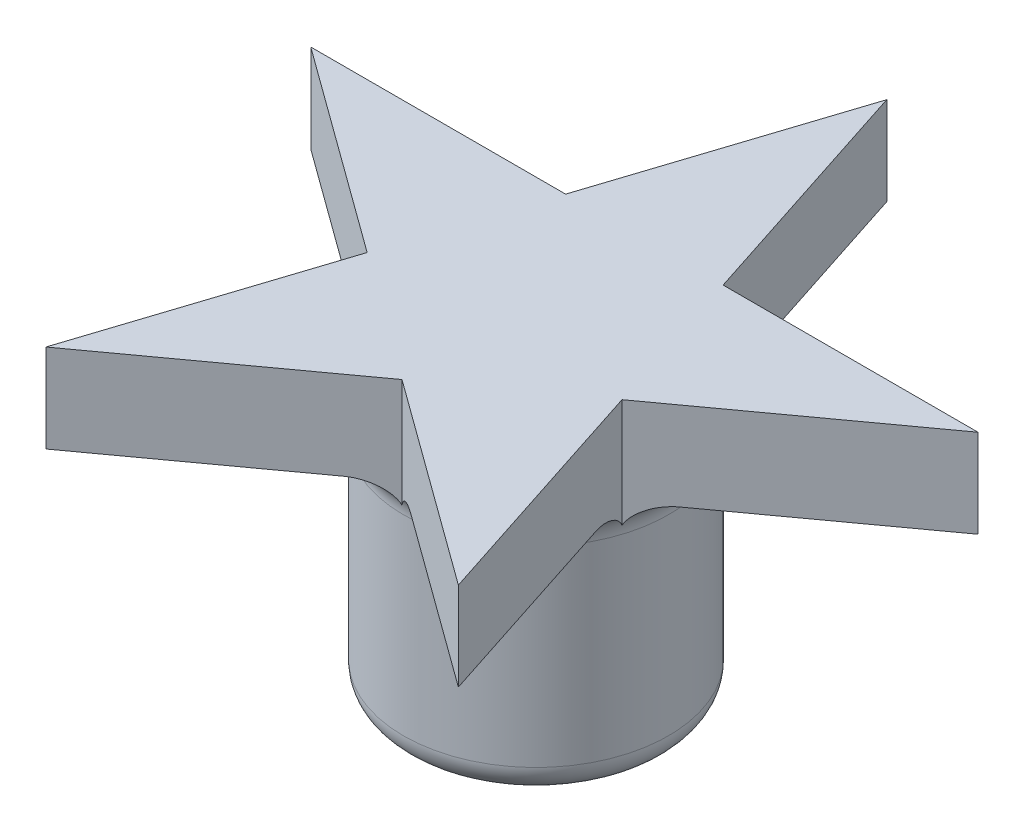
ISO-10303-21;
HEADER;
FILE_DESCRIPTION(('STEP AP214'),'2;1');
FILE_NAME('part.step','',(''),(''),'','','');
FILE_SCHEMA(('AUTOMOTIVE_DESIGN { 1 0 10303 214 1 1 1 1 }'));
ENDSEC;
DATA;
#1=APPLICATION_CONTEXT('core data for automotive mechanical design processes');
#2=APPLICATION_PROTOCOL_DEFINITION('international standard','automotive_design',2000,#1);
#3=PRODUCT_CONTEXT('',#1,'mechanical');
#4=PRODUCT('Part','Part','',(#3));
#5=PRODUCT_RELATED_PRODUCT_CATEGORY('part','',(#4));
#6=PRODUCT_DEFINITION_FORMATION('','',#4);
#7=PRODUCT_DEFINITION_CONTEXT('part definition',#1,'design');
#8=PRODUCT_DEFINITION('design','',#6,#7);
#9=PRODUCT_DEFINITION_SHAPE('','',#8);
#10=(LENGTH_UNIT() NAMED_UNIT(*) SI_UNIT(.MILLI.,.METRE.));
#11=(NAMED_UNIT(*) PLANE_ANGLE_UNIT() SI_UNIT($,.RADIAN.));
#12=(NAMED_UNIT(*) SI_UNIT($,.STERADIAN.) SOLID_ANGLE_UNIT());
#13=UNCERTAINTY_MEASURE_WITH_UNIT(LENGTH_MEASURE(1.E-05),#10,'distance_accuracy_value','');
#14=(GEOMETRIC_REPRESENTATION_CONTEXT(3) GLOBAL_UNCERTAINTY_ASSIGNED_CONTEXT((#13)) GLOBAL_UNIT_ASSIGNED_CONTEXT((#10,
#11,#12)) REPRESENTATION_CONTEXT('',''));
#15=CARTESIAN_POINT('',(0.,0.,0.));
#16=DIRECTION('',(0.,0.,1.));
#17=DIRECTION('',(1.,0.,0.));
#18=AXIS2_PLACEMENT_3D('',#15,#16,#17);
#19=CARTESIAN_POINT('',(0.,8.5,0.));
#20=DIRECTION('',(0.,-1.,0.));
#21=DIRECTION('',(0.,0.,-1.));
#22=AXIS2_PLACEMENT_3D('',#19,#20,#21);
#23=PLANE('',#22);
#24=DIRECTION('',(0.809016994374949,0.,0.58778525229247));
#25=VECTOR('',#24,1.);
#26=CARTESIAN_POINT('',(0.,8.5,4.54887574726061));
#27=LINE('',#26,#25);
#28=CARTESIAN_POINT('',(1.14364664453762,8.5,5.37978367152786));
#29=VERTEX_POINT('',#28);
#30=CARTESIAN_POINT('',(7.00000000000008,8.5,9.6346734432982));
#31=VERTEX_POINT('',#30);
#32=EDGE_CURVE('E224',#29,#31,#27,.T.);
#33=ORIENTED_EDGE('',*,*,#32,.F.);
#34=CARTESIAN_POINT('',(0.,8.5,0.));
#35=DIRECTION('',(0.,-1.,0.));
#36=DIRECTION('',(0.,0.,-1.));
#37=AXIS2_PLACEMENT_3D('',#34,#35,#36);
#38=CIRCLE('',#37,5.5);
#39=CARTESIAN_POINT('',(4.76307206834288,8.5,2.75011717418946));
#40=VERTEX_POINT('',#39);
#41=EDGE_CURVE('E307',#29,#40,#38,.F.);
#42=ORIENTED_EDGE('',*,*,#41,.T.);
#43=DIRECTION('',(0.309016994374952,0.,0.951056516295152));
#44=VECTOR('',#43,1.);
#45=CARTESIAN_POINT('',(4.32623792124928,8.5,1.4056799112035));
#46=LINE('',#45,#44);
#47=EDGE_CURVE('E226',#40,#31,#46,.T.);
#48=ORIENTED_EDGE('',*,*,#47,.T.);
#49=EDGE_LOOP('',(#33,#42,#48));
#50=FACE_BOUND('',#49,.T.);
#51=ADVANCED_FACE('F37',(#50),#23,.T.);
#52=DIRECTION('',(-0.809016994374951,0.,0.587785252292468));
#53=VECTOR('',#52,1.);
#54=CARTESIAN_POINT('',(11.3262379212493,8.5,-3.68011778483395));
#55=LINE('',#54,#53);
#56=CARTESIAN_POINT('',(11.3262379212493,8.5,-3.68011778483395));
#57=VERTEX_POINT('',#56);
#58=CARTESIAN_POINT('',(5.46988456578686,8.5,0.574771986936334));
#59=VERTEX_POINT('',#58);
#60=EDGE_CURVE('E229',#57,#59,#55,.T.);
#61=ORIENTED_EDGE('',*,*,#60,.T.);
#62=CARTESIAN_POINT('',(0.,8.5,0.));
#63=DIRECTION('',(0.,-1.,0.));
#64=DIRECTION('',(0.,0.,-1.));
#65=AXIS2_PLACEMENT_3D('',#62,#63,#64);
#66=CIRCLE('',#65,5.5);
#67=CARTESIAN_POINT('',(4.08738707363873,8.5,-3.68011778483394));
#68=VERTEX_POINT('',#67);
#69=EDGE_CURVE('E305',#59,#68,#66,.F.);
#70=ORIENTED_EDGE('',*,*,#69,.T.);
#71=DIRECTION('',(1.,0.,0.));
#72=VECTOR('',#71,1.);
#73=CARTESIAN_POINT('',(2.67376207875076,8.5,-3.68011778483394));
#74=LINE('',#73,#72);
#75=EDGE_CURVE('E232',#68,#57,#74,.T.);
#76=ORIENTED_EDGE('',*,*,#75,.T.);
#77=EDGE_LOOP('',(#61,#70,#76));
#78=FACE_BOUND('',#77,.T.);
#79=ADVANCED_FACE('F411',(#78),#23,.T.);
#80=DIRECTION('',(0.309016994374951,0.,0.951056516295152));
#81=VECTOR('',#80,1.);
#82=CARTESIAN_POINT('',(0.,8.5,-11.9091113169286));
#83=LINE('',#82,#81);
#84=CARTESIAN_POINT('',(0.,8.5,-11.9091113169286));
#85=VERTEX_POINT('',#84);
#86=CARTESIAN_POINT('',(2.23692793165717,8.5,-5.02455504781985));
#87=VERTEX_POINT('',#86);
#88=EDGE_CURVE('E234',#85,#87,#83,.T.);
#89=ORIENTED_EDGE('',*,*,#88,.T.);
#90=CARTESIAN_POINT('',(0.,8.5,0.));
#91=DIRECTION('',(0.,-1.,0.));
#92=DIRECTION('',(0.,0.,-1.));
#93=AXIS2_PLACEMENT_3D('',#90,#91,#92);
#94=CIRCLE('',#93,5.5);
#95=CARTESIAN_POINT('',(-2.23692793165722,8.5,-5.02455504781983));
#96=VERTEX_POINT('',#95);
#97=EDGE_CURVE('E303',#87,#96,#94,.F.);
#98=ORIENTED_EDGE('',*,*,#97,.T.);
#99=DIRECTION('',(-0.309016994374953,0.,0.951056516295152));
#100=VECTOR('',#99,1.);
#101=CARTESIAN_POINT('',(0.,8.5,-11.9091113169286));
#102=LINE('',#101,#100);
#103=EDGE_CURVE('E237',#85,#96,#102,.T.);
#104=ORIENTED_EDGE('',*,*,#103,.F.);
#105=EDGE_LOOP('',(#89,#98,#104));
#106=FACE_BOUND('',#105,.T.);
#107=ADVANCED_FACE('F417',(#106),#23,.T.);
#108=DIRECTION('',(1.,0.,0.));
#109=VECTOR('',#108,1.);
#110=CARTESIAN_POINT('',(-11.3262379212493,8.5,-3.68011778483392));
#111=LINE('',#110,#109);
#112=CARTESIAN_POINT('',(-11.3262379212493,8.5,-3.68011778483392));
#113=VERTEX_POINT('',#112);
#114=CARTESIAN_POINT('',(-4.08738707363874,8.5,-3.68011778483392));
#115=VERTEX_POINT('',#114);
#116=EDGE_CURVE('E181',#113,#115,#111,.T.);
#117=ORIENTED_EDGE('',*,*,#116,.T.);
#118=CARTESIAN_POINT('',(0.,8.5,0.));
#119=DIRECTION('',(0.,-1.,0.));
#120=DIRECTION('',(0.,0.,-1.));
#121=AXIS2_PLACEMENT_3D('',#118,#119,#120);
#122=CIRCLE('',#121,5.5);
#123=CARTESIAN_POINT('',(-5.46988456578685,8.5,0.574771986936398));
#124=VERTEX_POINT('',#123);
#125=EDGE_CURVE('E301',#115,#124,#122,.F.);
#126=ORIENTED_EDGE('',*,*,#125,.T.);
#127=DIRECTION('',(0.809016994374949,0.,0.587785252292471));
#128=VECTOR('',#127,1.);
#129=CARTESIAN_POINT('',(-11.3262379212493,8.5,-3.68011778483392));
#130=LINE('',#129,#128);
#131=EDGE_CURVE('E217',#113,#124,#130,.T.);
#132=ORIENTED_EDGE('',*,*,#131,.F.);
#133=EDGE_LOOP('',(#117,#126,#132));
#134=FACE_BOUND('',#133,.T.);
#135=ADVANCED_FACE('F422',(#134),#23,.T.);
#136=CARTESIAN_POINT('',(0.,2.5,0.));
#137=DIRECTION('',(0.,-1.,0.));
#138=DIRECTION('',(0.,0.,-1.));
#139=AXIS2_PLACEMENT_3D('',#136,#137,#138);
#140=PLANE('',#139);
#141=CARTESIAN_POINT('',(0.,2.5,0.));
#142=DIRECTION('',(0.,-1.,0.));
#143=DIRECTION('',(0.,0.,-1.));
#144=AXIS2_PLACEMENT_3D('',#141,#142,#143);
#145=CIRCLE('',#144,1.25);
#146=CARTESIAN_POINT('',(0.75,2.5,-1.));
#147=VERTEX_POINT('',#146);
#148=CARTESIAN_POINT('',(0.75,2.5,1.));
#149=VERTEX_POINT('',#148);
#150=EDGE_CURVE('E284',#147,#149,#145,.T.);
#151=ORIENTED_EDGE('',*,*,#150,.T.);
#152=DIRECTION('',(0.,0.,-1.));
#153=VECTOR('',#152,1.);
#154=CARTESIAN_POINT('',(0.75,2.5,1.));
#155=LINE('',#154,#153);
#156=EDGE_CURVE('E263',#149,#147,#155,.T.);
#157=ORIENTED_EDGE('',*,*,#156,.T.);
#158=EDGE_LOOP('',(#151,#157));
#159=FACE_BOUND('',#158,.T.);
#160=ADVANCED_FACE('F387',(#159),#140,.T.);
#161=CARTESIAN_POINT('',(0.,10.,0.));
#162=DIRECTION('',(0.,-1.,0.));
#163=DIRECTION('',(0.,0.,-1.));
#164=AXIS2_PLACEMENT_3D('',#161,#162,#163);
#165=CYLINDRICAL_SURFACE('',#164,4.5);
#166=CARTESIAN_POINT('',(0.,0.999999999999999,0.));
#167=DIRECTION('',(0.,1.,0.));
#168=DIRECTION('',(0.,0.,1.));
#169=AXIS2_PLACEMENT_3D('',#166,#167,#168);
#170=CIRCLE('',#169,4.5);
#171=CARTESIAN_POINT('',(0.,0.999999999999999,4.5));
#172=VERTEX_POINT('',#171);
#173=EDGE_CURVE('E293',#172,#172,#170,.T.);
#174=ORIENTED_EDGE('',*,*,#173,.T.);
#175=EDGE_LOOP('',(#174));
#176=FACE_BOUND('',#175,.T.);
#177=CARTESIAN_POINT('',(0.,7.5,0.));
#178=DIRECTION('',(0.,-1.,0.));
#179=DIRECTION('',(0.,0.,-1.));
#180=AXIS2_PLACEMENT_3D('',#177,#178,#179);
#181=CIRCLE('',#180,4.5);
#182=CARTESIAN_POINT('',(0.,7.5,-4.5));
#183=VERTEX_POINT('',#182);
#184=EDGE_CURVE('E287',#183,#183,#181,.T.);
#185=ORIENTED_EDGE('',*,*,#184,.T.);
#186=EDGE_LOOP('',(#185));
#187=FACE_BOUND('',#186,.T.);
#188=ADVANCED_FACE('F394',(#176,#187),#165,.T.);
#189=CARTESIAN_POINT('',(0.,0.,0.));
#190=DIRECTION('',(0.,1.,0.));
#191=DIRECTION('',(0.,0.,1.));
#192=AXIS2_PLACEMENT_3D('',#189,#190,#191);
#193=PLANE('',#192);
#194=CARTESIAN_POINT('',(0.,0.,0.));
#195=DIRECTION('',(0.,1.,0.));
#196=DIRECTION('',(0.,0.,1.));
#197=AXIS2_PLACEMENT_3D('',#194,#195,#196);
#198=CIRCLE('',#197,3.5);
#199=CARTESIAN_POINT('',(0.,0.,3.5));
#200=VERTEX_POINT('',#199);
#201=EDGE_CURVE('E296',#200,#200,#198,.F.);
#202=ORIENTED_EDGE('',*,*,#201,.T.);
#203=EDGE_LOOP('',(#202));
#204=FACE_BOUND('',#203,.T.);
#205=CARTESIAN_POINT('',(0.,0.,0.));
#206=DIRECTION('',(0.,-1.,0.));
#207=DIRECTION('',(0.,0.,-1.));
#208=AXIS2_PLACEMENT_3D('',#205,#206,#207);
#209=CIRCLE('',#208,1.25);
#210=CARTESIAN_POINT('',(0.,0.,-1.25));
#211=VERTEX_POINT('',#210);
#212=EDGE_CURVE('E278',#211,#211,#209,.T.);
#213=ORIENTED_EDGE('',*,*,#212,.F.);
#214=EDGE_LOOP('',(#213));
#215=FACE_BOUND('',#214,.T.);
#216=ADVANCED_FACE('F390',(#204,#215),#193,.F.);
#217=CARTESIAN_POINT('',(0.,2.5,0.));
#218=DIRECTION('',(0.,-1.,0.));
#219=DIRECTION('',(0.,0.,-1.));
#220=AXIS2_PLACEMENT_3D('',#217,#218,#219);
#221=CYLINDRICAL_SURFACE('',#220,1.25);
#222=ORIENTED_EDGE('',*,*,#150,.F.);
#223=DIRECTION('',(0.,-1.,0.));
#224=VECTOR('',#223,1.);
#225=CARTESIAN_POINT('',(0.75,8.5,-1.));
#226=LINE('',#225,#224);
#227=CARTESIAN_POINT('',(0.75,8.5,-1.));
#228=VERTEX_POINT('',#227);
#229=EDGE_CURVE('E279',#228,#147,#226,.T.);
#230=ORIENTED_EDGE('',*,*,#229,.F.);
#231=CARTESIAN_POINT('',(0.,8.5,0.));
#232=DIRECTION('',(0.,-1.,0.));
#233=DIRECTION('',(0.,0.,-1.));
#234=AXIS2_PLACEMENT_3D('',#231,#232,#233);
#235=CIRCLE('',#234,1.25);
#236=CARTESIAN_POINT('',(-0.75,8.5,-1.));
#237=VERTEX_POINT('',#236);
#238=EDGE_CURVE('E266',#237,#228,#235,.T.);
#239=ORIENTED_EDGE('',*,*,#238,.F.);
#240=DIRECTION('',(0.,-1.,0.));
#241=VECTOR('',#240,1.);
#242=CARTESIAN_POINT('',(-0.75,8.5,-1.));
#243=LINE('',#242,#241);
#244=CARTESIAN_POINT('',(-0.75,2.5,-1.));
#245=VERTEX_POINT('',#244);
#246=EDGE_CURVE('E281',#237,#245,#243,.T.);
#247=ORIENTED_EDGE('',*,*,#246,.T.);
#248=CARTESIAN_POINT('',(-0.75,2.5,1.));
#249=VERTEX_POINT('',#248);
#250=EDGE_CURVE('E288',#249,#245,#145,.T.);
#251=ORIENTED_EDGE('',*,*,#250,.F.);
#252=DIRECTION('',(0.,-1.,0.));
#253=VECTOR('',#252,1.);
#254=CARTESIAN_POINT('',(-0.75,8.5,1.));
#255=LINE('',#254,#253);
#256=CARTESIAN_POINT('',(-0.75,8.5,1.));
#257=VERTEX_POINT('',#256);
#258=EDGE_CURVE('E271',#257,#249,#255,.T.);
#259=ORIENTED_EDGE('',*,*,#258,.F.);
#260=CARTESIAN_POINT('',(0.,8.5,0.));
#261=DIRECTION('',(0.,-1.,0.));
#262=DIRECTION('',(0.,0.,-1.));
#263=AXIS2_PLACEMENT_3D('',#260,#261,#262);
#264=CIRCLE('',#263,1.25);
#265=CARTESIAN_POINT('',(0.75,8.5,1.));
#266=VERTEX_POINT('',#265);
#267=EDGE_CURVE('E259',#266,#257,#264,.T.);
#268=ORIENTED_EDGE('',*,*,#267,.F.);
#269=DIRECTION('',(0.,-1.,0.));
#270=VECTOR('',#269,1.);
#271=CARTESIAN_POINT('',(0.75,8.5,1.));
#272=LINE('',#271,#270);
#273=EDGE_CURVE('E276',#266,#149,#272,.T.);
#274=ORIENTED_EDGE('',*,*,#273,.T.);
#275=EDGE_LOOP('',(#222,#230,#239,#247,#251,#259,#268,#274));
#276=FACE_BOUND('',#275,.T.);
#277=ORIENTED_EDGE('',*,*,#212,.T.);
#278=EDGE_LOOP('',(#277));
#279=FACE_BOUND('',#278,.T.);
#280=ADVANCED_FACE('F385',(#276,#279),#221,.F.);
#281=DIRECTION('',(0.,0.,-1.));
#282=VECTOR('',#281,1.);
#283=CARTESIAN_POINT('',(-0.75,2.5,1.));
#284=LINE('',#283,#282);
#285=EDGE_CURVE('E244',#249,#245,#284,.T.);
#286=ORIENTED_EDGE('',*,*,#285,.F.);
#287=ORIENTED_EDGE('',*,*,#250,.T.);
#288=EDGE_LOOP('',(#286,#287));
#289=FACE_BOUND('',#288,.T.);
#290=ADVANCED_FACE('F378',(#289),#140,.T.);
#291=CARTESIAN_POINT('',(0.75,8.5,1.));
#292=DIRECTION('',(-1.,0.,0.));
#293=DIRECTION('',(0.,0.,1.));
#294=AXIS2_PLACEMENT_3D('',#291,#292,#293);
#295=PLANE('',#294);
#296=ORIENTED_EDGE('',*,*,#156,.F.);
#297=ORIENTED_EDGE('',*,*,#273,.F.);
#298=DIRECTION('',(0.,0.,-1.));
#299=VECTOR('',#298,1.);
#300=CARTESIAN_POINT('',(0.75,8.5,1.));
#301=LINE('',#300,#299);
#302=EDGE_CURVE('E269',#266,#228,#301,.T.);
#303=ORIENTED_EDGE('',*,*,#302,.T.);
#304=ORIENTED_EDGE('',*,*,#229,.T.);
#305=EDGE_LOOP('',(#296,#297,#303,#304));
#306=FACE_BOUND('',#305,.T.);
#307=ADVANCED_FACE('F375',(#306),#295,.T.);
#308=CARTESIAN_POINT('',(-0.75,8.5,1.));
#309=DIRECTION('',(-1.,0.,0.));
#310=DIRECTION('',(0.,0.,1.));
#311=AXIS2_PLACEMENT_3D('',#308,#309,#310);
#312=PLANE('',#311);
#313=ORIENTED_EDGE('',*,*,#285,.T.);
#314=ORIENTED_EDGE('',*,*,#246,.F.);
#315=DIRECTION('',(0.,0.,-1.));
#316=VECTOR('',#315,1.);
#317=CARTESIAN_POINT('',(-0.75,8.5,1.));
#318=LINE('',#317,#316);
#319=EDGE_CURVE('E262',#257,#237,#318,.T.);
#320=ORIENTED_EDGE('',*,*,#319,.F.);
#321=ORIENTED_EDGE('',*,*,#258,.T.);
#322=EDGE_LOOP('',(#313,#314,#320,#321));
#323=FACE_BOUND('',#322,.T.);
#324=ADVANCED_FACE('F373',(#323),#312,.F.);
#325=CARTESIAN_POINT('',(0.,8.5,0.));
#326=DIRECTION('',(0.,-1.,0.));
#327=DIRECTION('',(0.,0.,-1.));
#328=AXIS2_PLACEMENT_3D('',#325,#326,#327);
#329=PLANE('',#328);
#330=ORIENTED_EDGE('',*,*,#267,.T.);
#331=ORIENTED_EDGE('',*,*,#319,.T.);
#332=ORIENTED_EDGE('',*,*,#238,.T.);
#333=ORIENTED_EDGE('',*,*,#302,.F.);
#334=EDGE_LOOP('',(#330,#331,#332,#333));
#335=FACE_BOUND('',#334,.T.);
#336=ADVANCED_FACE('F370',(#335),#329,.T.);
#337=CARTESIAN_POINT('',(-11.3262379212493,8.5,-3.68011778483392));
#338=DIRECTION('',(-0.587785252292471,0.,0.809016994374949));
#339=DIRECTION('',(0.809016994374949,0.,0.587785252292471));
#340=AXIS2_PLACEMENT_3D('',#337,#338,#339);
#341=PLANE('',#340);
#342=DIRECTION('',(0.,1.,0.));
#343=VECTOR('',#342,1.);
#344=CARTESIAN_POINT('',(-4.32623792124934,8.5,1.40567991120352));
#345=LINE('',#344,#343);
#346=CARTESIAN_POINT('',(-4.32623792124934,7.80880844523961,1.40567991120352));
#347=VERTEX_POINT('',#346);
#348=CARTESIAN_POINT('',(-4.32623792124934,11.5,1.40567991120352));
#349=VERTEX_POINT('',#348);
#350=EDGE_CURVE('E65',#347,#349,#345,.T.);
#351=ORIENTED_EDGE('',*,*,#350,.T.);
#352=DIRECTION('',(0.809016994374949,0.,0.587785252292471));
#353=VECTOR('',#352,1.);
#354=CARTESIAN_POINT('',(-11.3262379212493,11.5,-3.68011778483392));
#355=LINE('',#354,#353);
#356=CARTESIAN_POINT('',(-11.3262379212493,11.5,-3.68011778483392));
#357=VERTEX_POINT('',#356);
#358=EDGE_CURVE('E174',#357,#349,#355,.T.);
#359=ORIENTED_EDGE('',*,*,#358,.F.);
#360=DIRECTION('',(0.,1.,0.));
#361=VECTOR('',#360,1.);
#362=CARTESIAN_POINT('',(-11.3262379212493,8.5,-3.68011778483392));
#363=LINE('',#362,#361);
#364=EDGE_CURVE('E242',#113,#357,#363,.T.);
#365=ORIENTED_EDGE('',*,*,#364,.F.);
#366=ORIENTED_EDGE('',*,*,#131,.T.);
#367=CARTESIAN_POINT('',(-5.46988456578685,8.5,0.574771986936398));
#368=CARTESIAN_POINT('',(-5.42674472431918,8.49999157223654,0.606114916414068));
#369=CARTESIAN_POINT('',(-5.38361841330433,8.4976444396555,0.63744801544234));
#370=CARTESIAN_POINT('',(-5.29768635730506,8.48846555977177,0.699881308644754));
#371=CARTESIAN_POINT('',(-5.25488054841814,8.48163473189638,0.730981549246766));
#372=CARTESIAN_POINT('',(-5.16884542659802,8.46346576385764,0.793489724151206));
#373=CARTESIAN_POINT('',(-5.12563058535154,8.4520234349466,0.824887144157777));
#374=CARTESIAN_POINT('',(-5.04010927292878,8.42476796821553,0.887022014683745));
#375=CARTESIAN_POINT('',(-4.99780286768368,8.40895451430191,0.917759417301336));
#376=CARTESIAN_POINT('',(-4.91423925575865,8.37294302757433,0.978471935158607));
#377=CARTESIAN_POINT('',(-4.87298684525021,8.35272794780613,1.00844356577572));
#378=CARTESIAN_POINT('',(-4.79207213895995,8.30791685470545,1.06723154103666));
#379=CARTESIAN_POINT('',(-4.75240954781196,8.28332165980188,1.09604810027656));
#380=CARTESIAN_POINT('',(-4.67561471690901,8.22992573241031,1.15184281085854));
#381=CARTESIAN_POINT('',(-4.63845711399485,8.20118119643556,1.17883938961441));
#382=CARTESIAN_POINT('',(-4.56682444146758,8.13902031516997,1.23088357260015));
#383=CARTESIAN_POINT('',(-4.53234703382948,8.10560811446582,1.25593287550461));
#384=CARTESIAN_POINT('',(-4.46570780328122,8.03223313994777,1.30434911053148));
#385=CARTESIAN_POINT('',(-4.4336898901037,7.99206480135843,1.32761148611293));
#386=CARTESIAN_POINT('',(-4.38982029918507,7.92714246268331,1.3594846096015));
#387=CARTESIAN_POINT('',(-4.37582823315125,7.90459366015239,1.36965044062973));
#388=CARTESIAN_POINT('',(-4.34960951177229,7.85789723121397,1.38869945674147));
#389=CARTESIAN_POINT('',(-4.33738761252776,7.83374554275931,1.39757918631562));
#390=CARTESIAN_POINT('',(-4.32623792124939,7.80880844523954,1.40567991120348));
#391=B_SPLINE_CURVE_WITH_KNOTS('',3,(#367,#368,#369,#370,#371,#372,#373,#374,#375,#376,#377,
#378,#379,#380,#381,#382,#383,#384,#385,#386,#387,#388,#389,#390),.UNSPECIFIED.,.F.,.F.,(4,2,2,
2,2,2,2,2,2,2,2,4),(0.,0.159896121871335,0.319759465656678,0.483457533451968,0.647167442009747,
0.811523028421989,0.975847936986992,1.13812613914375,1.30026115385965,1.46875701126089,
1.55389554376734,1.63925874466646),.UNSPECIFIED.);
#392=EDGE_CURVE('E178',#124,#347,#391,.T.);
#393=ORIENTED_EDGE('',*,*,#392,.T.);
#394=EDGE_LOOP('',(#351,#359,#365,#366,#393));
#395=FACE_BOUND('',#394,.T.);
#396=ADVANCED_FACE('F172',(#395),#341,.T.);
#397=CARTESIAN_POINT('',(-11.3262379212493,8.5,-3.68011778483392));
#398=DIRECTION('',(0.,0.,1.));
#399=DIRECTION('',(1.,0.,0.));
#400=AXIS2_PLACEMENT_3D('',#397,#398,#399);
#401=PLANE('',#400);
#402=ORIENTED_EDGE('',*,*,#364,.T.);
#403=DIRECTION('',(1.,0.,0.));
#404=VECTOR('',#403,1.);
#405=CARTESIAN_POINT('',(-11.3262379212493,11.5,-3.68011778483392));
#406=LINE('',#405,#404);
#407=CARTESIAN_POINT('',(-2.67376207875081,11.5,-3.68011778483392));
#408=VERTEX_POINT('',#407);
#409=EDGE_CURVE('E195',#357,#408,#406,.T.);
#410=ORIENTED_EDGE('',*,*,#409,.T.);
#411=DIRECTION('',(0.,1.,0.));
#412=VECTOR('',#411,1.);
#413=CARTESIAN_POINT('',(-2.67376207875081,8.5,-3.68011778483392));
#414=LINE('',#413,#412);
#415=CARTESIAN_POINT('',(-2.67376207875081,7.80880844523954,-3.68011778483392));
#416=VERTEX_POINT('',#415);
#417=EDGE_CURVE('E245',#416,#408,#414,.T.);
#418=ORIENTED_EDGE('',*,*,#417,.F.);
#419=CARTESIAN_POINT('',(-2.67376207875081,7.80880844523954,-3.68011778483392));
#420=CARTESIAN_POINT('',(-2.68908910801704,7.83653447397854,-3.68011778483392));
#421=CARTESIAN_POINT('',(-2.70604407635004,7.86328249306219,-3.68011778483392));
#422=CARTESIAN_POINT('',(-2.74260165072432,7.9147890160933,-3.68011778483392));
#423=CARTESIAN_POINT('',(-2.7621958700997,7.93955344112207,-3.68011778483392));
#424=CARTESIAN_POINT('',(-2.82373741291257,8.01054671086188,-3.68011778483392));
#425=CARTESIAN_POINT('',(-2.86880349595716,8.05407926117512,-3.68011778483392));
#426=CARTESIAN_POINT('',(-2.95055244614498,8.12279525204187,-3.68011778483392));
#427=CARTESIAN_POINT('',(-2.98589173757352,8.14964479224912,-3.68011778483392));
#428=CARTESIAN_POINT('',(-3.05876070842287,8.20020432518873,-3.68011778483392));
#429=CARTESIAN_POINT('',(-3.09629098736822,8.22391345274695,-3.68011778483392));
#430=CARTESIAN_POINT('',(-3.21193733247647,8.29084013031703,-3.68011778483392));
#431=CARTESIAN_POINT('',(-3.29270315801129,8.32952939357033,-3.68011778483392));
#432=CARTESIAN_POINT('',(-3.46212051377146,8.39672888763224,-3.68011778483392));
#433=CARTESIAN_POINT('',(-3.55095962534171,8.42475637281436,-3.68011778483392));
#434=CARTESIAN_POINT('',(-3.73137424808457,8.46804385625576,-3.68011778483392));
#435=CARTESIAN_POINT('',(-3.8229375779441,8.48335379923956,-3.68011778483392));
#436=CARTESIAN_POINT('',(-3.97237057518398,8.49725651408739,-3.68011778483392));
#437=CARTESIAN_POINT('',(-4.02987829506125,8.49998302824974,-3.68011778483392));
#438=CARTESIAN_POINT('',(-4.08738707363874,8.5,-3.68011778483392));
#439=B_SPLINE_CURVE_WITH_KNOTS('',3,(#419,#420,#421,#422,#423,#424,#425,#426,#427,#428,#429,
#430,#431,#432,#433,#434,#435,#436,#437,#438),.UNSPECIFIED.,.F.,.F.,(4,2,2,2,2,2,2,2,2,4),(0.,
0.0948794938873878,0.18946430810651,0.376559103197512,0.509558507251264,0.642594476362354,
0.910212610810865,1.18881047728542,1.46630898248391,1.63879432818788),.UNSPECIFIED.);
#440=EDGE_CURVE('E359',#416,#115,#439,.T.);
#441=ORIENTED_EDGE('',*,*,#440,.T.);
#442=ORIENTED_EDGE('',*,*,#116,.F.);
#443=EDGE_LOOP('',(#402,#410,#418,#441,#442));
#444=FACE_BOUND('',#443,.T.);
#445=ADVANCED_FACE('F369',(#444),#401,.F.);
#446=CARTESIAN_POINT('',(0.,8.5,-11.9091113169286));
#447=DIRECTION('',(-0.951056516295152,0.,-0.309016994374953));
#448=DIRECTION('',(-0.309016994374953,0.,0.951056516295152));
#449=AXIS2_PLACEMENT_3D('',#446,#447,#448);
#450=PLANE('',#449);
#451=ORIENTED_EDGE('',*,*,#417,.T.);
#452=DIRECTION('',(-0.309016994374953,0.,0.951056516295152));
#453=VECTOR('',#452,1.);
#454=CARTESIAN_POINT('',(0.,11.5,-11.9091113169286));
#455=LINE('',#454,#453);
#456=CARTESIAN_POINT('',(0.,11.5,-11.9091113169286));
#457=VERTEX_POINT('',#456);
#458=EDGE_CURVE('E214',#457,#408,#455,.T.);
#459=ORIENTED_EDGE('',*,*,#458,.F.);
#460=DIRECTION('',(0.,1.,0.));
#461=VECTOR('',#460,1.);
#462=CARTESIAN_POINT('',(0.,8.5,-11.9091113169286));
#463=LINE('',#462,#461);
#464=EDGE_CURVE('E247',#85,#457,#463,.T.);
#465=ORIENTED_EDGE('',*,*,#464,.F.);
#466=ORIENTED_EDGE('',*,*,#103,.T.);
#467=CARTESIAN_POINT('',(-2.23692793165722,8.5,-5.02455504781983));
#468=CARTESIAN_POINT('',(-2.25340588482858,8.49999157223654,-4.97384112261797));
#469=CARTESIAN_POINT('',(-2.26987866982686,8.4976444396555,-4.92314310341736));
#470=CARTESIAN_POINT('',(-2.30270179449542,8.48846555977177,-4.82212391298626));
#471=CARTESIAN_POINT('',(-2.31905215857429,8.48163473189638,-4.7718026666339));
#472=CARTESIAN_POINT('',(-2.35191465088334,8.46346576385764,-4.67066231506379));
#473=CARTESIAN_POINT('',(-2.36842125142107,8.4520234349466,-4.6198602223341));
#474=CARTESIAN_POINT('',(-2.40108748600407,8.42476796821553,-4.5193238899365));
#475=CARTESIAN_POINT('',(-2.41724709486587,8.4089545143019,-4.46958972777535));
#476=CARTESIAN_POINT('',(-2.44916555439853,8.37294302757432,-4.37135481033969));
#477=CARTESIAN_POINT('',(-2.46492257309489,8.35272794780613,-4.32285969330295));
#478=CARTESIAN_POINT('',(-2.49582924070806,8.30791685470544,-4.22773875120095));
#479=CARTESIAN_POINT('',(-2.5109790024447,8.28332165980187,-4.18111257891196));
#480=CARTESIAN_POINT('',(-2.54031201768933,8.22992573241029,-4.09083484079786));
#481=CARTESIAN_POINT('',(-2.55450495906206,8.20118119643555,-4.0471534587909));
#482=CARTESIAN_POINT('',(-2.58186620526249,8.13902031516995,-3.96294420180324));
#483=CARTESIAN_POINT('',(-2.59503540313626,8.1056081144658,-3.92241357830933));
#484=CARTESIAN_POINT('',(-2.62048932422156,8.03223313994774,-3.84407446442855));
#485=CARTESIAN_POINT('',(-2.63271907880653,7.9920648013584,-3.80643515007869));
#486=CARTESIAN_POINT('',(-2.6494757714649,7.92714246268327,-3.75486335294655));
#487=CARTESIAN_POINT('',(-2.65482026511698,7.90459366015234,-3.73841469281898));
#488=CARTESIAN_POINT('',(-2.66483492554218,7.85789723121391,-3.70759273729794));
#489=CARTESIAN_POINT('',(-2.66950327564652,7.83374554275924,-3.69322503303605));
#490=CARTESIAN_POINT('',(-2.67376207875079,7.80880844523947,-3.68011778483398));
#491=B_SPLINE_CURVE_WITH_KNOTS('',3,(#467,#468,#469,#470,#471,#472,#473,#474,#475,#476,#477,
#478,#479,#480,#481,#482,#483,#484,#485,#486,#487,#488,#489,#490),.UNSPECIFIED.,.F.,.F.,(4,2,2,
2,2,2,2,2,2,2,2,4),(0.,0.159896121871343,0.319759465656691,0.483457533451991,0.647167442009779,
0.811523028422029,0.97584793698704,1.1381261391438,1.30026115385971,1.46875701126098,
1.55389554376744,1.63925874466658),.UNSPECIFIED.);
#492=EDGE_CURVE('E469',#96,#416,#491,.T.);
#493=ORIENTED_EDGE('',*,*,#492,.T.);
#494=EDGE_LOOP('',(#451,#459,#465,#466,#493));
#495=FACE_BOUND('',#494,.T.);
#496=ADVANCED_FACE('F470',(#495),#450,.T.);
#497=CARTESIAN_POINT('',(0.,8.5,-11.9091113169286));
#498=DIRECTION('',(-0.951056516295152,0.,0.309016994374951));
#499=DIRECTION('',(0.309016994374951,0.,0.951056516295152));
#500=AXIS2_PLACEMENT_3D('',#497,#498,#499);
#501=PLANE('',#500);
#502=ORIENTED_EDGE('',*,*,#464,.T.);
#503=DIRECTION('',(0.309016994374951,0.,0.951056516295152));
#504=VECTOR('',#503,1.);
#505=CARTESIAN_POINT('',(0.,11.5,-11.9091113169286));
#506=LINE('',#505,#504);
#507=CARTESIAN_POINT('',(2.67376207875076,11.5,-3.68011778483394));
#508=VERTEX_POINT('',#507);
#509=EDGE_CURVE('E211',#457,#508,#506,.T.);
#510=ORIENTED_EDGE('',*,*,#509,.T.);
#511=DIRECTION('',(0.,1.,0.));
#512=VECTOR('',#511,1.);
#513=CARTESIAN_POINT('',(2.67376207875076,8.5,-3.68011778483394));
#514=LINE('',#513,#512);
#515=CARTESIAN_POINT('',(2.67376207875076,7.8088084452395,-3.68011778483394));
#516=VERTEX_POINT('',#515);
#517=EDGE_CURVE('E249',#516,#508,#514,.T.);
#518=ORIENTED_EDGE('',*,*,#517,.F.);
#519=CARTESIAN_POINT('',(2.67376207875076,7.8088084452395,-3.68011778483394));
#520=CARTESIAN_POINT('',(2.66902576623421,7.83653447397849,-3.69469465589303));
#521=CARTESIAN_POINT('',(2.66378639288023,7.86328249306215,-3.7108197890097));
#522=CARTESIAN_POINT('',(2.65248948112545,7.91478901609326,-3.74558810833831));
#523=CARTESIAN_POINT('',(2.64643453434695,7.93955344112202,-3.76422331835698));
#524=CARTESIAN_POINT('',(2.62741715175772,8.01054671086183,-3.82275280367201));
#525=CARTESIAN_POINT('',(2.61349096622703,8.05407926117507,-3.86561319561546));
#526=CARTESIAN_POINT('',(2.58822915134668,8.12279525204183,-3.94336106739187));
#527=CARTESIAN_POINT('',(2.5773087097261,8.14964479224908,-3.97697073078623));
#528=CARTESIAN_POINT('',(2.55479095937104,8.20020432518868,-4.04627324034822));
#529=CARTESIAN_POINT('',(2.54319346537329,8.22391345274691,-4.08196665669757));
#530=CARTESIAN_POINT('',(2.5074567793975,8.29084013031699,-4.19195286679848));
#531=CARTESIAN_POINT('',(2.48249876674251,8.32952939357029,-4.26876573146732));
#532=CARTESIAN_POINT('',(2.43014592467056,8.39672888763221,-4.42989121163652));
#533=CARTESIAN_POINT('',(2.40269312943018,8.42475637281433,-4.51438222759727));
#534=CARTESIAN_POINT('',(2.34694194496889,8.46804385625574,-4.68596673019179));
#535=CARTESIAN_POINT('',(2.31864731998074,8.48335379923955,-4.77304863170838));
#536=CARTESIAN_POINT('',(2.27246998431322,8.49725651408739,-4.91516785748292));
#537=CARTESIAN_POINT('',(2.25469912156337,8.49998302824974,-4.96986094920951));
#538=CARTESIAN_POINT('',(2.23692793165717,8.5,-5.02455504781985));
#539=B_SPLINE_CURVE_WITH_KNOTS('',3,(#519,#520,#521,#522,#523,#524,#525,#526,#527,#528,#529,
#530,#531,#532,#533,#534,#535,#536,#537,#538),.UNSPECIFIED.,.F.,.F.,(4,2,2,2,2,2,2,2,2,4),(0.,
0.094879493887383,0.189464308106499,0.376559103197493,0.50955850725124,0.642594476362323,
0.910212610810823,1.18881047728537,1.46630898248385,1.63879432818795),.UNSPECIFIED.);
#540=EDGE_CURVE('E465',#516,#87,#539,.T.);
#541=ORIENTED_EDGE('',*,*,#540,.T.);
#542=ORIENTED_EDGE('',*,*,#88,.F.);
#543=EDGE_LOOP('',(#502,#510,#518,#541,#542));
#544=FACE_BOUND('',#543,.T.);
#545=ADVANCED_FACE('F463',(#544),#501,.F.);
#546=CARTESIAN_POINT('',(2.67376207875076,8.5,-3.68011778483394));
#547=DIRECTION('',(0.,0.,1.));
#548=DIRECTION('',(1.,0.,0.));
#549=AXIS2_PLACEMENT_3D('',#546,#547,#548);
#550=PLANE('',#549);
#551=ORIENTED_EDGE('',*,*,#517,.T.);
#552=DIRECTION('',(1.,0.,0.));
#553=VECTOR('',#552,1.);
#554=CARTESIAN_POINT('',(2.67376207875076,11.5,-3.68011778483394));
#555=LINE('',#554,#553);
#556=CARTESIAN_POINT('',(11.3262379212493,11.5,-3.68011778483395));
#557=VERTEX_POINT('',#556);
#558=EDGE_CURVE('E208',#508,#557,#555,.T.);
#559=ORIENTED_EDGE('',*,*,#558,.T.);
#560=DIRECTION('',(0.,1.,0.));
#561=VECTOR('',#560,1.);
#562=CARTESIAN_POINT('',(11.3262379212493,8.5,-3.68011778483395));
#563=LINE('',#562,#561);
#564=EDGE_CURVE('E251',#57,#557,#563,.T.);
#565=ORIENTED_EDGE('',*,*,#564,.F.);
#566=ORIENTED_EDGE('',*,*,#75,.F.);
#567=CARTESIAN_POINT('',(4.08738707363873,8.5,-3.68011778483394));
#568=CARTESIAN_POINT('',(4.03406329704612,8.49999157223654,-3.68011778483394));
#569=CARTESIAN_POINT('',(3.98075624501297,8.4976444396555,-3.68011778483394));
#570=CARTESIAN_POINT('',(3.87453838235155,8.48846555977177,-3.68011778483394));
#571=CARTESIAN_POINT('',(3.82162749273546,8.48163473189638,-3.68011778483394));
#572=CARTESIAN_POINT('',(3.71528223371331,8.46346576385764,-3.68011778483394));
#573=CARTESIAN_POINT('',(3.66186575229579,8.4520234349466,-3.68011778483394));
#574=CARTESIAN_POINT('',(3.55615559661626,8.42476796821553,-3.68011778483394));
#575=CARTESIAN_POINT('',(3.50386200384967,8.40895451430191,-3.68011778483394));
#576=CARTESIAN_POINT('',(3.40057169906492,8.37294302757432,-3.68011778483394));
#577=CARTESIAN_POINT('',(3.34958091544077,8.35272794780613,-3.68011778483394));
#578=CARTESIAN_POINT('',(3.24956483808657,8.30791685470544,-3.68011778483394));
#579=CARTESIAN_POINT('',(3.20053917926387,8.28332165980188,-3.68011778483394));
#580=CARTESIAN_POINT('',(3.10561554794722,8.2299257324103,-3.68011778483394));
#581=CARTESIAN_POINT('',(3.05968622486438,8.20118119643556,-3.68011778483394));
#582=CARTESIAN_POINT('',(2.97114337221069,8.13902031516997,-3.68011778483394));
#583=CARTESIAN_POINT('',(2.92852695268203,8.10560811446581,-3.68011778483394));
#584=CARTESIAN_POINT('',(2.84615633375608,8.03223313994775,-3.68011778483394));
#585=CARTESIAN_POINT('',(2.80658001657096,7.9920648013584,-3.68011778483394));
#586=CARTESIAN_POINT('',(2.75235422005042,7.92714246268325,-3.68011778483394));
#587=CARTESIAN_POINT('',(2.73505907528695,7.90459366015232,-3.68011778483394));
#588=CARTESIAN_POINT('',(2.70265095337942,7.85789723121388,-3.68011778483394));
#589=CARTESIAN_POINT('',(2.68754385509902,7.83374554275921,-3.68011778483394));
#590=CARTESIAN_POINT('',(2.67376207875082,7.80880844523943,-3.68011778483394));
#591=B_SPLINE_CURVE_WITH_KNOTS('',3,(#567,#568,#569,#570,#571,#572,#573,#574,#575,#576,#577,
#578,#579,#580,#581,#582,#583,#584,#585,#586,#587,#588,#589,#590),.UNSPECIFIED.,.F.,.F.,(4,2,2,
2,2,2,2,2,2,2,2,4),(0.,0.159896121871337,0.319759465656681,0.483457533451973,0.647167442009755,
0.811523028422,0.975847936987004,1.13812613914376,1.30026115385966,1.46875701126097,
1.55389554376745,1.63925874466659),.UNSPECIFIED.);
#592=EDGE_CURVE('E460',#68,#516,#591,.T.);
#593=ORIENTED_EDGE('',*,*,#592,.T.);
#594=EDGE_LOOP('',(#551,#559,#565,#566,#593));
#595=FACE_BOUND('',#594,.T.);
#596=ADVANCED_FACE('F456',(#595),#550,.F.);
#597=CARTESIAN_POINT('',(11.3262379212493,8.5,-3.68011778483395));
#598=DIRECTION('',(-0.587785252292468,0.,-0.809016994374951));
#599=DIRECTION('',(-0.809016994374951,0.,0.587785252292468));
#600=AXIS2_PLACEMENT_3D('',#597,#598,#599);
#601=PLANE('',#600);
#602=ORIENTED_EDGE('',*,*,#564,.T.);
#603=DIRECTION('',(-0.809016994374951,0.,0.587785252292468));
#604=VECTOR('',#603,1.);
#605=CARTESIAN_POINT('',(11.3262379212493,11.5,-3.68011778483395));
#606=LINE('',#605,#604);
#607=CARTESIAN_POINT('',(4.32623792124928,11.5,1.4056799112035));
#608=VERTEX_POINT('',#607);
#609=EDGE_CURVE('E205',#557,#608,#606,.T.);
#610=ORIENTED_EDGE('',*,*,#609,.T.);
#611=DIRECTION('',(0.,1.,0.));
#612=VECTOR('',#611,1.);
#613=CARTESIAN_POINT('',(4.32623792124928,8.5,1.4056799112035));
#614=LINE('',#613,#612);
#615=CARTESIAN_POINT('',(4.32623792124928,7.80880844523941,1.4056799112035));
#616=VERTEX_POINT('',#615);
#617=EDGE_CURVE('E253',#616,#608,#614,.T.);
#618=ORIENTED_EDGE('',*,*,#617,.F.);
#619=CARTESIAN_POINT('',(4.32623792124928,7.80880844523941,1.4056799112035));
#620=CARTESIAN_POINT('',(4.33863774839894,7.83653447397841,1.39667090943936));
#621=CARTESIAN_POINT('',(4.35235460591941,7.86328249306206,1.38670502910014));
#622=CARTESIAN_POINT('',(4.38193030486132,7.91478901609316,1.36521702602337));
#623=CARTESIAN_POINT('',(4.39778236132751,7.93955344112193,1.35369983284434));
#624=CARTESIAN_POINT('',(4.44757051532316,8.01054671086174,1.31752662157562));
#625=CARTESIAN_POINT('',(4.48402974237613,8.05407926117498,1.29103744258343));
#626=CARTESIAN_POINT('',(4.55016603235036,8.12279525204173,1.24298661527266));
#627=CARTESIAN_POINT('',(4.57875611968521,8.14964479224898,1.22221470094451));
#628=CARTESIAN_POINT('',(4.63770835546492,8.20020432518859,1.17938339452955));
#629=CARTESIAN_POINT('',(4.66807098893533,8.22391345274681,1.15732365005106));
#630=CARTESIAN_POINT('',(4.76163084746522,8.29084013031689,1.08934843391492));
#631=CARTESIAN_POINT('',(4.82697177288759,8.3295293935702,1.04187547277635));
#632=CARTESIAN_POINT('',(4.9640332928396,8.39672888763213,0.94229444957816));
#633=CARTESIAN_POINT('',(5.03590564386508,8.42475637281425,0.89007612997042));
#634=CARTESIAN_POINT('',(5.18186413969776,8.46804385625568,0.784031075424286));
#635=CARTESIAN_POINT('',(5.25594042961566,8.4833537992395,0.730211500482077));
#636=CARTESIAN_POINT('',(5.37683426390321,8.49725651408738,0.642376988498542));
#637=CARTESIAN_POINT('',(5.4233589865918,8.49998302824974,0.608574798861627));
#638=CARTESIAN_POINT('',(5.46988456578686,8.5,0.574771986936335));
#639=B_SPLINE_CURVE_WITH_KNOTS('',3,(#619,#620,#621,#622,#623,#624,#625,#626,#627,#628,#629,
#630,#631,#632,#633,#634,#635,#636,#637,#638),.UNSPECIFIED.,.F.,.F.,(4,2,2,2,2,2,2,2,2,4),(0.,
0.094879493887367,0.189464308106469,0.376559103197436,0.509558507251157,0.642594476362213,
0.910212610810659,1.18881047728515,1.46630898248357,1.638794328188),.UNSPECIFIED.);
#640=EDGE_CURVE('E318',#616,#59,#639,.T.);
#641=ORIENTED_EDGE('',*,*,#640,.T.);
#642=ORIENTED_EDGE('',*,*,#60,.F.);
#643=EDGE_LOOP('',(#602,#610,#618,#641,#642));
#644=FACE_BOUND('',#643,.T.);
#645=ADVANCED_FACE('F329',(#644),#601,.F.);
#646=CARTESIAN_POINT('',(4.32623792124928,8.5,1.4056799112035));
#647=DIRECTION('',(-0.951056516295152,0.,0.309016994374952));
#648=DIRECTION('',(0.309016994374952,0.,0.951056516295152));
#649=AXIS2_PLACEMENT_3D('',#646,#647,#648);
#650=PLANE('',#649);
#651=ORIENTED_EDGE('',*,*,#617,.T.);
#652=DIRECTION('',(0.309016994374952,0.,0.951056516295152));
#653=VECTOR('',#652,1.);
#654=CARTESIAN_POINT('',(4.32623792124928,11.5,1.4056799112035));
#655=LINE('',#654,#653);
#656=CARTESIAN_POINT('',(7.00000000000008,11.5,9.6346734432982));
#657=VERTEX_POINT('',#656);
#658=EDGE_CURVE('E202',#608,#657,#655,.T.);
#659=ORIENTED_EDGE('',*,*,#658,.T.);
#660=DIRECTION('',(0.,1.,0.));
#661=VECTOR('',#660,1.);
#662=CARTESIAN_POINT('',(7.00000000000008,8.5,9.6346734432982));
#663=LINE('',#662,#661);
#664=EDGE_CURVE('E255',#31,#657,#663,.T.);
#665=ORIENTED_EDGE('',*,*,#664,.F.);
#666=ORIENTED_EDGE('',*,*,#47,.F.);
#667=CARTESIAN_POINT('',(4.76307206834288,8.5,2.75011717418946));
#668=CARTESIAN_POINT('',(4.74659411517152,8.49999157223654,2.6994032489876));
#669=CARTESIAN_POINT('',(4.73012133017324,8.4976444396555,2.64870522978699));
#670=CARTESIAN_POINT('',(4.69729820550468,8.48846555977177,2.54768603935589));
#671=CARTESIAN_POINT('',(4.68094784142581,8.48163473189638,2.49736479300354));
#672=CARTESIAN_POINT('',(4.64808534911676,8.46346576385764,2.39622444143343));
#673=CARTESIAN_POINT('',(4.63157874857903,8.4520234349466,2.34542234870374));
#674=CARTESIAN_POINT('',(4.59891251399603,8.42476796821553,2.24488601630614));
#675=CARTESIAN_POINT('',(4.58275290513423,8.4089545143019,2.19515185414499));
#676=CARTESIAN_POINT('',(4.55083444560158,8.37294302757432,2.09691693670934));
#677=CARTESIAN_POINT('',(4.53507742690522,8.35272794780613,2.04842181967259));
#678=CARTESIAN_POINT('',(4.50417075929205,8.30791685470544,1.9533008775706));
#679=CARTESIAN_POINT('',(4.48902099755541,8.28332165980187,1.90667470528161));
#680=CARTESIAN_POINT('',(4.45968798231078,8.2299257324103,1.81639696716751));
#681=CARTESIAN_POINT('',(4.44549504093804,8.20118119643555,1.77271558516055));
#682=CARTESIAN_POINT('',(4.41813379473762,8.13902031516996,1.68850632817289));
#683=CARTESIAN_POINT('',(4.40496459686385,8.10560811446581,1.64797570467899));
#684=CARTESIAN_POINT('',(4.37951067577854,8.03223313994773,1.56963659079819));
#685=CARTESIAN_POINT('',(4.36728092119356,7.99206480135837,1.53199727644831));
#686=CARTESIAN_POINT('',(4.3505242285352,7.9271424626832,1.48042547931615));
#687=CARTESIAN_POINT('',(4.34517973488311,7.90459366015227,1.46397681918858));
#688=CARTESIAN_POINT('',(4.33516507445791,7.85789723121381,1.43315486366753));
#689=CARTESIAN_POINT('',(4.33049672435357,7.83374554275913,1.41878715940564));
#690=CARTESIAN_POINT('',(4.3262379212493,7.80880844523934,1.40567991120356));
#691=B_SPLINE_CURVE_WITH_KNOTS('',3,(#667,#668,#669,#670,#671,#672,#673,#674,#675,#676,#677,
#678,#679,#680,#681,#682,#683,#684,#685,#686,#687,#688,#689,#690),.UNSPECIFIED.,.F.,.F.,(4,2,2,
2,2,2,2,2,2,2,2,4),(0.,0.159896121871339,0.319759465656685,0.483457533451981,0.647167442009765,
0.811523028422013,0.975847936987021,1.13812613914378,1.30026115385969,1.46875701126103,
1.55389554376753,1.6392587446667),.UNSPECIFIED.);
#692=EDGE_CURVE('E310',#40,#616,#691,.T.);
#693=ORIENTED_EDGE('',*,*,#692,.T.);
#694=EDGE_LOOP('',(#651,#659,#665,#666,#693));
#695=FACE_BOUND('',#694,.T.);
#696=ADVANCED_FACE('F325',(#695),#650,.F.);
#697=CARTESIAN_POINT('',(0.,8.5,4.54887574726061));
#698=DIRECTION('',(-0.58778525229247,0.,0.809016994374949));
#699=DIRECTION('',(0.809016994374949,0.,0.58778525229247));
#700=AXIS2_PLACEMENT_3D('',#697,#698,#699);
#701=PLANE('',#700);
#702=ORIENTED_EDGE('',*,*,#664,.T.);
#703=DIRECTION('',(0.809016994374949,0.,0.58778525229247));
#704=VECTOR('',#703,1.);
#705=CARTESIAN_POINT('',(0.,11.5,4.54887574726061));
#706=LINE('',#705,#704);
#707=CARTESIAN_POINT('',(0.,11.5,4.54887574726061));
#708=VERTEX_POINT('',#707);
#709=EDGE_CURVE('E199',#708,#657,#706,.T.);
#710=ORIENTED_EDGE('',*,*,#709,.F.);
#711=DIRECTION('',(0.,1.,0.));
#712=VECTOR('',#711,1.);
#713=CARTESIAN_POINT('',(0.,8.5,4.54887574726061));
#714=LINE('',#713,#712);
#715=CARTESIAN_POINT('',(0.,7.8088084452392,4.54887574726061));
#716=VERTEX_POINT('',#715);
#717=EDGE_CURVE('E57',#716,#708,#714,.T.);
#718=ORIENTED_EDGE('',*,*,#717,.F.);
#719=CARTESIAN_POINT('',(0.,7.8088084452392,4.54887574726061));
#720=CARTESIAN_POINT('',(0.0123998271495766,7.83653447397819,4.55788474902474));
#721=CARTESIAN_POINT('',(0.0261166846700424,7.86328249306184,4.56785062936395));
#722=CARTESIAN_POINT('',(0.0556923836119282,7.91478901609294,4.58933863244071));
#723=CARTESIAN_POINT('',(0.0715444400781056,7.9395534411217,4.60085582561973));
#724=CARTESIAN_POINT('',(0.121332594073722,8.0105467108615,4.63702903688843));
#725=CARTESIAN_POINT('',(0.157791821126671,8.05407926117475,4.6635182158806));
#726=CARTESIAN_POINT('',(0.223928111100869,8.12279525204149,4.71156904319135));
#727=CARTESIAN_POINT('',(0.252518198435703,8.14964479224875,4.73234095751949));
#728=CARTESIAN_POINT('',(0.311470434215387,8.20020432518835,4.77517226393443));
#729=CARTESIAN_POINT('',(0.341833067685782,8.22391345274658,4.79723200841291));
#730=CARTESIAN_POINT('',(0.435392926215631,8.29084013031667,4.86520722454901));
#731=CARTESIAN_POINT('',(0.500733851637975,8.32952939356999,4.91268018568757));
#732=CARTESIAN_POINT('',(0.637795371589926,8.39672888763194,5.01226120888572));
#733=CARTESIAN_POINT('',(0.709667722615379,8.42475637281409,5.06447952849344));
#734=CARTESIAN_POINT('',(0.855626218448008,8.46804385625555,5.17052458303954));
#735=CARTESIAN_POINT('',(0.929702508365883,8.48335379923941,5.22434415798173));
#736=CARTESIAN_POINT('',(1.0505963426536,8.49725651408736,5.31217866996538));
#737=CARTESIAN_POINT('',(1.09712106534237,8.49998302824974,5.34598085960243));
#738=CARTESIAN_POINT('',(1.14364664453762,8.5,5.37978367152787));
#739=B_SPLINE_CURVE_WITH_KNOTS('',3,(#719,#720,#721,#722,#723,#724,#725,#726,#727,#728,#729,
#730,#731,#732,#733,#734,#735,#736,#737,#738),.UNSPECIFIED.,.F.,.F.,(4,2,2,2,2,2,2,2,2,4),(0.,
0.0948794938873387,0.189464308106413,0.376559103197319,0.509558507250998,0.642594476362014,
0.91021261081038,1.1888104772848,1.46630898248314,1.63879432818827),.UNSPECIFIED.);
#740=EDGE_CURVE('E11',#716,#29,#739,.T.);
#741=ORIENTED_EDGE('',*,*,#740,.T.);
#742=ORIENTED_EDGE('',*,*,#32,.T.);
#743=EDGE_LOOP('',(#702,#710,#718,#741,#742));
#744=FACE_BOUND('',#743,.T.);
#745=ADVANCED_FACE('F328',(#744),#701,.T.);
#746=CARTESIAN_POINT('',(0.,8.5,4.54887574726061));
#747=DIRECTION('',(-0.587785252292466,0.,-0.809016994374952));
#748=DIRECTION('',(-0.809016994374953,0.,0.587785252292466));
#749=AXIS2_PLACEMENT_3D('',#746,#747,#748);
#750=PLANE('',#749);
#751=ORIENTED_EDGE('',*,*,#717,.T.);
#752=DIRECTION('',(-0.809016994374952,0.,0.587785252292466));
#753=VECTOR('',#752,1.);
#754=CARTESIAN_POINT('',(0.,11.5,4.54887574726061));
#755=LINE('',#754,#753);
#756=CARTESIAN_POINT('',(-7.0000000000001,11.5,9.63467344329806));
#757=VERTEX_POINT('',#756);
#758=EDGE_CURVE('E190',#708,#757,#755,.T.);
#759=ORIENTED_EDGE('',*,*,#758,.T.);
#760=DIRECTION('',(0.,1.,0.));
#761=VECTOR('',#760,1.);
#762=CARTESIAN_POINT('',(-7.0000000000001,8.5,9.63467344329806));
#763=LINE('',#762,#761);
#764=CARTESIAN_POINT('',(-7.0000000000001,8.5,9.63467344329806));
#765=VERTEX_POINT('',#764);
#766=EDGE_CURVE('E180',#765,#757,#763,.T.);
#767=ORIENTED_EDGE('',*,*,#766,.F.);
#768=DIRECTION('',(-0.809016994374952,0.,0.587785252292466));
#769=VECTOR('',#768,1.);
#770=CARTESIAN_POINT('',(0.,8.5,4.54887574726061));
#771=LINE('',#770,#769);
#772=CARTESIAN_POINT('',(-1.14364664453774,8.5,5.37978367152784));
#773=VERTEX_POINT('',#772);
#774=EDGE_CURVE('E221',#773,#765,#771,.T.);
#775=ORIENTED_EDGE('',*,*,#774,.F.);
#776=CARTESIAN_POINT('',(-1.14364664453774,8.5,5.37978367152784));
#777=CARTESIAN_POINT('',(-1.10050680307008,8.49999157223654,5.34844074205017));
#778=CARTESIAN_POINT('',(-1.05738049205523,8.4976444396555,5.3171076430219));
#779=CARTESIAN_POINT('',(-0.971448436055954,8.48846555977177,5.25467434981949));
#780=CARTESIAN_POINT('',(-0.928642627169042,8.48163473189638,5.22357410921748));
#781=CARTESIAN_POINT('',(-0.842607505348923,8.46346576385765,5.16106593431304));
#782=CARTESIAN_POINT('',(-0.79939266410244,8.45202343494661,5.12966851430647));
#783=CARTESIAN_POINT('',(-0.713871351679682,8.42476796821554,5.06753364378051));
#784=CARTESIAN_POINT('',(-0.671564946434586,8.40895451430191,5.03679624116292));
#785=CARTESIAN_POINT('',(-0.588001334509557,8.37294302757433,4.97608372330565));
#786=CARTESIAN_POINT('',(-0.546748924001124,8.35272794780614,4.94611209268854));
#787=CARTESIAN_POINT('',(-0.465834217710859,8.30791685470545,4.8873241174276));
#788=CARTESIAN_POINT('',(-0.426171626562872,8.28332165980189,4.8585075581877));
#789=CARTESIAN_POINT('',(-0.349376795659923,8.22992573241031,4.80271284760572));
#790=CARTESIAN_POINT('',(-0.312219192745769,8.20118119643557,4.77571626884986));
#791=CARTESIAN_POINT('',(-0.240586520218501,8.13902031516998,4.72367208586412));
#792=CARTESIAN_POINT('',(-0.206109112580398,8.10560811446583,4.69862278295966));
#793=CARTESIAN_POINT('',(-0.139469882032089,8.03223313994773,4.65020654793276));
#794=CARTESIAN_POINT('',(-0.107451968854527,7.99206480135833,4.62694417235128));
#795=CARTESIAN_POINT('',(-0.0635823779358527,7.92714246268311,4.59507104886266));
#796=CARTESIAN_POINT('',(-0.0495903119020192,7.90459366015215,4.58490521783442));
#797=CARTESIAN_POINT('',(-0.0233715905230357,7.85789723121364,4.56585620172267));
#798=CARTESIAN_POINT('',(-0.0111496912784908,7.83374554275894,4.55697647214851));
#799=CARTESIAN_POINT('',(-1.23581603684387E-13,7.80880844523913,4.54887574726065));
#800=B_SPLINE_CURVE_WITH_KNOTS('',3,(#776,#777,#778,#779,#780,#781,#782,#783,#784,#785,#786,
#787,#788,#789,#790,#791,#792,#793,#794,#795,#796,#797,#798,#799),.UNSPECIFIED.,.F.,.F.,(4,2,2,
2,2,2,2,2,2,2,2,4),(0.,0.159896121871329,0.319759465656665,0.48345753345195,0.647167442009727,
0.811523028421963,0.975847936986963,1.13812613914371,1.30026115385961,1.46875701126109,
1.55389554376766,1.6392587446669),.UNSPECIFIED.);
#801=EDGE_CURVE('E51',#773,#716,#800,.T.);
#802=ORIENTED_EDGE('',*,*,#801,.T.);
#803=EDGE_LOOP('',(#751,#759,#767,#775,#802));
#804=FACE_BOUND('',#803,.T.);
#805=ADVANCED_FACE('F336',(#804),#750,.F.);
#806=CARTESIAN_POINT('',(-4.32623792124934,8.5,1.40567991120352));
#807=DIRECTION('',(-0.951056516295152,0.,-0.309016994374953));
#808=DIRECTION('',(-0.309016994374953,0.,0.951056516295152));
#809=AXIS2_PLACEMENT_3D('',#806,#807,#808);
#810=PLANE('',#809);
#811=ORIENTED_EDGE('',*,*,#766,.T.);
#812=DIRECTION('',(-0.309016994374953,0.,0.951056516295152));
#813=VECTOR('',#812,1.);
#814=CARTESIAN_POINT('',(-4.32623792124934,11.5,1.40567991120352));
#815=LINE('',#814,#813);
#816=EDGE_CURVE('E184',#349,#757,#815,.T.);
#817=ORIENTED_EDGE('',*,*,#816,.F.);
#818=ORIENTED_EDGE('',*,*,#350,.F.);
#819=CARTESIAN_POINT('',(-4.32623792124934,7.80880844523961,1.40567991120352));
#820=CARTESIAN_POINT('',(-4.33097423376589,7.83653447397861,1.42025678226263));
#821=CARTESIAN_POINT('',(-4.33621360711988,7.86328249306227,1.43638191537931));
#822=CARTESIAN_POINT('',(-4.34751051887466,7.91478901609338,1.47115023470792));
#823=CARTESIAN_POINT('',(-4.35356546565317,7.93955344112215,1.4897854447266));
#824=CARTESIAN_POINT('',(-4.3725828482424,8.01054671086196,1.54831493004166));
#825=CARTESIAN_POINT('',(-4.3865090337731,8.0540792611752,1.59117532198512));
#826=CARTESIAN_POINT('',(-4.41177084865345,8.12279525204195,1.66892319376156));
#827=CARTESIAN_POINT('',(-4.42269129027404,8.1496447922492,1.70253285715593));
#828=CARTESIAN_POINT('',(-4.44520904062911,8.20020432518881,1.77183536671794));
#829=CARTESIAN_POINT('',(-4.45680653462686,8.22391345274704,1.8075287830673));
#830=CARTESIAN_POINT('',(-4.49254322060266,8.29084013031711,1.91751499316824));
#831=CARTESIAN_POINT('',(-4.51750123325765,8.32952939357041,1.99432785783711));
#832=CARTESIAN_POINT('',(-4.56985407532963,8.39672888763231,2.15545333800635));
#833=CARTESIAN_POINT('',(-4.59730687057001,8.42475637281442,2.23994435396712));
#834=CARTESIAN_POINT('',(-4.65305805503131,8.4680438562558,2.41152885656168));
#835=CARTESIAN_POINT('',(-4.68135268001947,8.4833537992396,2.49861075807829));
#836=CARTESIAN_POINT('',(-4.72753001568695,8.4972565140874,2.64072998385272));
#837=CARTESIAN_POINT('',(-4.74530087843676,8.49998302824974,2.69542307557919));
#838=CARTESIAN_POINT('',(-4.76307206834292,8.5,2.7501171741894));
#839=B_SPLINE_CURVE_WITH_KNOTS('',3,(#819,#820,#821,#822,#823,#824,#825,#826,#827,#828,#829,
#830,#831,#832,#833,#834,#835,#836,#837,#838),.UNSPECIFIED.,.F.,.F.,(4,2,2,2,2,2,2,2,2,4),(0.,
0.0948794938874003,0.189464308106534,0.376559103197562,0.509558507251336,0.642594476362447,
0.910212610811002,1.18881047728561,1.46630898248414,1.63879432818784),.UNSPECIFIED.);
#840=CARTESIAN_POINT('',(-4.76307206834292,8.5,2.7501171741894));
#841=VERTEX_POINT('',#840);
#842=EDGE_CURVE('E348',#347,#841,#839,.T.);
#843=ORIENTED_EDGE('',*,*,#842,.T.);
#844=DIRECTION('',(-0.309016994374953,0.,0.951056516295152));
#845=VECTOR('',#844,1.);
#846=CARTESIAN_POINT('',(-4.32623792124934,8.5,1.40567991120352));
#847=LINE('',#846,#845);
#848=EDGE_CURVE('E219',#841,#765,#847,.T.);
#849=ORIENTED_EDGE('',*,*,#848,.T.);
#850=EDGE_LOOP('',(#811,#817,#818,#843,#849));
#851=FACE_BOUND('',#850,.T.);
#852=ADVANCED_FACE('F185',(#851),#810,.T.);
#853=ORIENTED_EDGE('',*,*,#848,.F.);
#854=CARTESIAN_POINT('',(0.,8.5,0.));
#855=DIRECTION('',(0.,-1.,0.));
#856=DIRECTION('',(0.,0.,-1.));
#857=AXIS2_PLACEMENT_3D('',#854,#855,#856);
#858=CIRCLE('',#857,5.5);
#859=EDGE_CURVE('E299',#841,#773,#858,.F.);
#860=ORIENTED_EDGE('',*,*,#859,.T.);
#861=ORIENTED_EDGE('',*,*,#774,.T.);
#862=EDGE_LOOP('',(#853,#860,#861));
#863=FACE_BOUND('',#862,.T.);
#864=ADVANCED_FACE('F406',(#863),#23,.T.);
#865=CARTESIAN_POINT('',(0.,11.5,0.));
#866=DIRECTION('',(0.,-1.,0.));
#867=DIRECTION('',(0.,0.,-1.));
#868=AXIS2_PLACEMENT_3D('',#865,#866,#867);
#869=PLANE('',#868);
#870=ORIENTED_EDGE('',*,*,#358,.T.);
#871=ORIENTED_EDGE('',*,*,#816,.T.);
#872=ORIENTED_EDGE('',*,*,#758,.F.);
#873=ORIENTED_EDGE('',*,*,#709,.T.);
#874=ORIENTED_EDGE('',*,*,#658,.F.);
#875=ORIENTED_EDGE('',*,*,#609,.F.);
#876=ORIENTED_EDGE('',*,*,#558,.F.);
#877=ORIENTED_EDGE('',*,*,#509,.F.);
#878=ORIENTED_EDGE('',*,*,#458,.T.);
#879=ORIENTED_EDGE('',*,*,#409,.F.);
#880=EDGE_LOOP('',(#870,#871,#872,#873,#874,#875,#876,#877,#878,#879));
#881=FACE_BOUND('',#880,.T.);
#882=ADVANCED_FACE('F192',(#881),#869,.F.);
#883=CARTESIAN_POINT('',(0.,0.999999999999999,0.));
#884=DIRECTION('',(0.,1.,0.));
#885=DIRECTION('',(0.,0.,1.));
#886=AXIS2_PLACEMENT_3D('',#883,#884,#885);
#887=TOROIDAL_SURFACE('',#886,3.5,1.);
#888=ORIENTED_EDGE('',*,*,#201,.F.);
#889=EDGE_LOOP('',(#888));
#890=FACE_BOUND('',#889,.T.);
#891=ORIENTED_EDGE('',*,*,#173,.F.);
#892=EDGE_LOOP('',(#891));
#893=FACE_BOUND('',#892,.T.);
#894=ADVANCED_FACE('F398',(#890,#893),#887,.T.);
#895=CARTESIAN_POINT('',(0.,7.5,0.));
#896=DIRECTION('',(0.,-1.,0.));
#897=DIRECTION('',(0.,0.,-1.));
#898=AXIS2_PLACEMENT_3D('',#895,#896,#897);
#899=TOROIDAL_SURFACE('',#898,5.5,1.);
#900=ORIENTED_EDGE('',*,*,#692,.F.);
#901=ORIENTED_EDGE('',*,*,#41,.F.);
#902=ORIENTED_EDGE('',*,*,#740,.F.);
#903=ORIENTED_EDGE('',*,*,#801,.F.);
#904=ORIENTED_EDGE('',*,*,#859,.F.);
#905=ORIENTED_EDGE('',*,*,#842,.F.);
#906=ORIENTED_EDGE('',*,*,#392,.F.);
#907=ORIENTED_EDGE('',*,*,#125,.F.);
#908=ORIENTED_EDGE('',*,*,#440,.F.);
#909=ORIENTED_EDGE('',*,*,#492,.F.);
#910=ORIENTED_EDGE('',*,*,#97,.F.);
#911=ORIENTED_EDGE('',*,*,#540,.F.);
#912=ORIENTED_EDGE('',*,*,#592,.F.);
#913=ORIENTED_EDGE('',*,*,#69,.F.);
#914=ORIENTED_EDGE('',*,*,#640,.F.);
#915=EDGE_LOOP('',(#900,#901,#902,#903,#904,#905,#906,#907,#908,#909,#910,#911,#912,#913,#914));
#916=FACE_BOUND('',#915,.T.);
#917=ORIENTED_EDGE('',*,*,#184,.F.);
#918=EDGE_LOOP('',(#917));
#919=FACE_BOUND('',#918,.T.);
#920=ADVANCED_FACE('F39',(#916,#919),#899,.F.);
#921=CLOSED_SHELL('',(#51,#79,#107,#135,#160,#188,#216,#280,#290,#307,#324,#336,#396,#445,#496,
#545,#596,#645,#696,#745,#805,#852,#864,#882,#894,#920));
#922=MANIFOLD_SOLID_BREP('B2',#921);
#923=ADVANCED_BREP_SHAPE_REPRESENTATION('',(#18,#922),#14);
#924=SHAPE_DEFINITION_REPRESENTATION(#9,#923);
ENDSEC;
END-ISO-10303-21;
